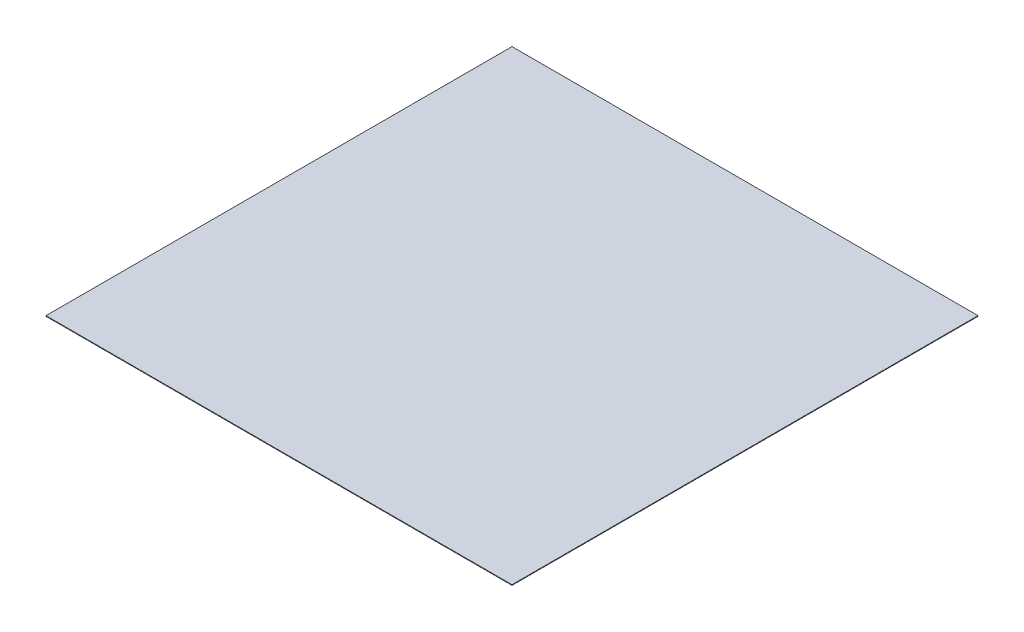
ISO-10303-21;
HEADER;
FILE_DESCRIPTION(('STEP AP214'),'2;1');
FILE_NAME('part.step','',(''),(''),'','','');
FILE_SCHEMA(('AUTOMOTIVE_DESIGN { 1 0 10303 214 1 1 1 1 }'));
ENDSEC;
DATA;
#1=APPLICATION_CONTEXT('core data for automotive mechanical design processes');
#2=APPLICATION_PROTOCOL_DEFINITION('international standard','automotive_design',2000,#1);
#3=PRODUCT_CONTEXT('',#1,'mechanical');
#4=PRODUCT('Part','Part','',(#3));
#5=PRODUCT_RELATED_PRODUCT_CATEGORY('part','',(#4));
#6=PRODUCT_DEFINITION_FORMATION('','',#4);
#7=PRODUCT_DEFINITION_CONTEXT('part definition',#1,'design');
#8=PRODUCT_DEFINITION('design','',#6,#7);
#9=PRODUCT_DEFINITION_SHAPE('','',#8);
#10=(LENGTH_UNIT() NAMED_UNIT(*) SI_UNIT(.MILLI.,.METRE.));
#11=(NAMED_UNIT(*) PLANE_ANGLE_UNIT() SI_UNIT($,.RADIAN.));
#12=(NAMED_UNIT(*) SI_UNIT($,.STERADIAN.) SOLID_ANGLE_UNIT());
#13=UNCERTAINTY_MEASURE_WITH_UNIT(LENGTH_MEASURE(1.E-05),#10,'distance_accuracy_value','');
#14=(GEOMETRIC_REPRESENTATION_CONTEXT(3) GLOBAL_UNCERTAINTY_ASSIGNED_CONTEXT((#13)) GLOBAL_UNIT_ASSIGNED_CONTEXT((#10,
#11,#12)) REPRESENTATION_CONTEXT('',''));
#15=CARTESIAN_POINT('',(0.,0.,0.));
#16=DIRECTION('',(0.,0.,1.));
#17=DIRECTION('',(1.,0.,0.));
#18=AXIS2_PLACEMENT_3D('',#15,#16,#17);
#19=CARTESIAN_POINT('',(95.,0.125,95.));
#20=DIRECTION('',(-1.,0.,0.));
#21=DIRECTION('',(0.,0.,1.));
#22=AXIS2_PLACEMENT_3D('',#19,#20,#21);
#23=PLANE('',#22);
#24=DIRECTION('',(0.,0.,-1.));
#25=VECTOR('',#24,1.);
#26=CARTESIAN_POINT('',(95.,-0.125,95.));
#27=LINE('',#26,#25);
#28=CARTESIAN_POINT('',(95.,-0.125,95.));
#29=VERTEX_POINT('',#28);
#30=CARTESIAN_POINT('',(95.,-0.125,-95.));
#31=VERTEX_POINT('',#30);
#32=EDGE_CURVE('E104',#29,#31,#27,.T.);
#33=ORIENTED_EDGE('',*,*,#32,.T.);
#34=DIRECTION('',(0.,-1.,0.));
#35=VECTOR('',#34,1.);
#36=CARTESIAN_POINT('',(95.,0.125,-95.));
#37=LINE('',#36,#35);
#38=CARTESIAN_POINT('',(95.,0.125,-95.));
#39=VERTEX_POINT('',#38);
#40=EDGE_CURVE('E11',#39,#31,#37,.T.);
#41=ORIENTED_EDGE('',*,*,#40,.F.);
#42=DIRECTION('',(0.,0.,-1.));
#43=VECTOR('',#42,1.);
#44=CARTESIAN_POINT('',(95.,0.125,95.));
#45=LINE('',#44,#43);
#46=CARTESIAN_POINT('',(95.,0.125,95.));
#47=VERTEX_POINT('',#46);
#48=EDGE_CURVE('E92',#47,#39,#45,.T.);
#49=ORIENTED_EDGE('',*,*,#48,.F.);
#50=DIRECTION('',(0.,-1.,0.));
#51=VECTOR('',#50,1.);
#52=CARTESIAN_POINT('',(95.,0.125,95.));
#53=LINE('',#52,#51);
#54=EDGE_CURVE('E100',#47,#29,#53,.T.);
#55=ORIENTED_EDGE('',*,*,#54,.T.);
#56=EDGE_LOOP('',(#33,#41,#49,#55));
#57=FACE_BOUND('',#56,.T.);
#58=ADVANCED_FACE('F41',(#57),#23,.F.);
#59=CARTESIAN_POINT('',(-95.,0.125,-95.));
#60=DIRECTION('',(0.,0.,1.));
#61=DIRECTION('',(1.,0.,0.));
#62=AXIS2_PLACEMENT_3D('',#59,#60,#61);
#63=PLANE('',#62);
#64=DIRECTION('',(-1.,0.,0.));
#65=VECTOR('',#64,1.);
#66=CARTESIAN_POINT('',(-95.,-0.125,-95.));
#67=LINE('',#66,#65);
#68=CARTESIAN_POINT('',(-95.,-0.125,-95.));
#69=VERTEX_POINT('',#68);
#70=EDGE_CURVE('E96',#31,#69,#67,.T.);
#71=ORIENTED_EDGE('',*,*,#70,.T.);
#72=DIRECTION('',(0.,-1.,0.));
#73=VECTOR('',#72,1.);
#74=CARTESIAN_POINT('',(-95.,0.125,-95.));
#75=LINE('',#74,#73);
#76=CARTESIAN_POINT('',(-95.,0.125,-95.));
#77=VERTEX_POINT('',#76);
#78=EDGE_CURVE('E49',#77,#69,#75,.T.);
#79=ORIENTED_EDGE('',*,*,#78,.F.);
#80=DIRECTION('',(-1.,0.,0.));
#81=VECTOR('',#80,1.);
#82=CARTESIAN_POINT('',(-95.,0.125,-95.));
#83=LINE('',#82,#81);
#84=EDGE_CURVE('E87',#39,#77,#83,.T.);
#85=ORIENTED_EDGE('',*,*,#84,.F.);
#86=ORIENTED_EDGE('',*,*,#40,.T.);
#87=EDGE_LOOP('',(#71,#79,#85,#86));
#88=FACE_BOUND('',#87,.T.);
#89=ADVANCED_FACE('F95',(#88),#63,.F.);
#90=CARTESIAN_POINT('',(-95.,0.125,95.));
#91=DIRECTION('',(1.,0.,0.));
#92=DIRECTION('',(0.,0.,-1.));
#93=AXIS2_PLACEMENT_3D('',#90,#91,#92);
#94=PLANE('',#93);
#95=DIRECTION('',(0.,0.,1.));
#96=VECTOR('',#95,1.);
#97=CARTESIAN_POINT('',(-95.,-0.125,95.));
#98=LINE('',#97,#96);
#99=CARTESIAN_POINT('',(-95.,-0.125,95.));
#100=VERTEX_POINT('',#99);
#101=EDGE_CURVE('E74',#69,#100,#98,.T.);
#102=ORIENTED_EDGE('',*,*,#101,.T.);
#103=DIRECTION('',(0.,-1.,0.));
#104=VECTOR('',#103,1.);
#105=CARTESIAN_POINT('',(-95.,0.125,95.));
#106=LINE('',#105,#104);
#107=CARTESIAN_POINT('',(-95.,0.125,95.));
#108=VERTEX_POINT('',#107);
#109=EDGE_CURVE('E97',#108,#100,#106,.T.);
#110=ORIENTED_EDGE('',*,*,#109,.F.);
#111=DIRECTION('',(0.,0.,1.));
#112=VECTOR('',#111,1.);
#113=CARTESIAN_POINT('',(-95.,0.125,95.));
#114=LINE('',#113,#112);
#115=EDGE_CURVE('E90',#77,#108,#114,.T.);
#116=ORIENTED_EDGE('',*,*,#115,.F.);
#117=ORIENTED_EDGE('',*,*,#78,.T.);
#118=EDGE_LOOP('',(#102,#110,#116,#117));
#119=FACE_BOUND('',#118,.T.);
#120=ADVANCED_FACE('F98',(#119),#94,.F.);
#121=CARTESIAN_POINT('',(-95.,0.125,95.));
#122=DIRECTION('',(0.,0.,-1.));
#123=DIRECTION('',(-1.,0.,0.));
#124=AXIS2_PLACEMENT_3D('',#121,#122,#123);
#125=PLANE('',#124);
#126=DIRECTION('',(1.,0.,0.));
#127=VECTOR('',#126,1.);
#128=CARTESIAN_POINT('',(-95.,-0.125,95.));
#129=LINE('',#128,#127);
#130=EDGE_CURVE('E80',#100,#29,#129,.T.);
#131=ORIENTED_EDGE('',*,*,#130,.T.);
#132=ORIENTED_EDGE('',*,*,#54,.F.);
#133=DIRECTION('',(1.,0.,0.));
#134=VECTOR('',#133,1.);
#135=CARTESIAN_POINT('',(-95.,0.125,95.));
#136=LINE('',#135,#134);
#137=EDGE_CURVE('E57',#108,#47,#136,.T.);
#138=ORIENTED_EDGE('',*,*,#137,.F.);
#139=ORIENTED_EDGE('',*,*,#109,.T.);
#140=EDGE_LOOP('',(#131,#132,#138,#139));
#141=FACE_BOUND('',#140,.T.);
#142=ADVANCED_FACE('F111',(#141),#125,.F.);
#143=CARTESIAN_POINT('',(0.,0.125,0.));
#144=DIRECTION('',(0.,-1.,0.));
#145=DIRECTION('',(0.,0.,-1.));
#146=AXIS2_PLACEMENT_3D('',#143,#144,#145);
#147=PLANE('',#146);
#148=ORIENTED_EDGE('',*,*,#48,.T.);
#149=ORIENTED_EDGE('',*,*,#84,.T.);
#150=ORIENTED_EDGE('',*,*,#115,.T.);
#151=ORIENTED_EDGE('',*,*,#137,.T.);
#152=EDGE_LOOP('',(#148,#149,#150,#151));
#153=FACE_BOUND('',#152,.T.);
#154=ADVANCED_FACE('F88',(#153),#147,.F.);
#155=CARTESIAN_POINT('',(0.,-0.125,0.));
#156=DIRECTION('',(0.,-1.,0.));
#157=DIRECTION('',(0.,0.,-1.));
#158=AXIS2_PLACEMENT_3D('',#155,#156,#157);
#159=PLANE('',#158);
#160=ORIENTED_EDGE('',*,*,#32,.F.);
#161=ORIENTED_EDGE('',*,*,#130,.F.);
#162=ORIENTED_EDGE('',*,*,#101,.F.);
#163=ORIENTED_EDGE('',*,*,#70,.F.);
#164=EDGE_LOOP('',(#160,#161,#162,#163));
#165=FACE_BOUND('',#164,.T.);
#166=ADVANCED_FACE('F114',(#165),#159,.T.);
#167=CLOSED_SHELL('',(#58,#89,#120,#142,#154,#166));
#168=MANIFOLD_SOLID_BREP('B2',#167);
#169=ADVANCED_BREP_SHAPE_REPRESENTATION('',(#18,#168),#14);
#170=SHAPE_DEFINITION_REPRESENTATION(#9,#169);
ENDSEC;
END-ISO-10303-21;
